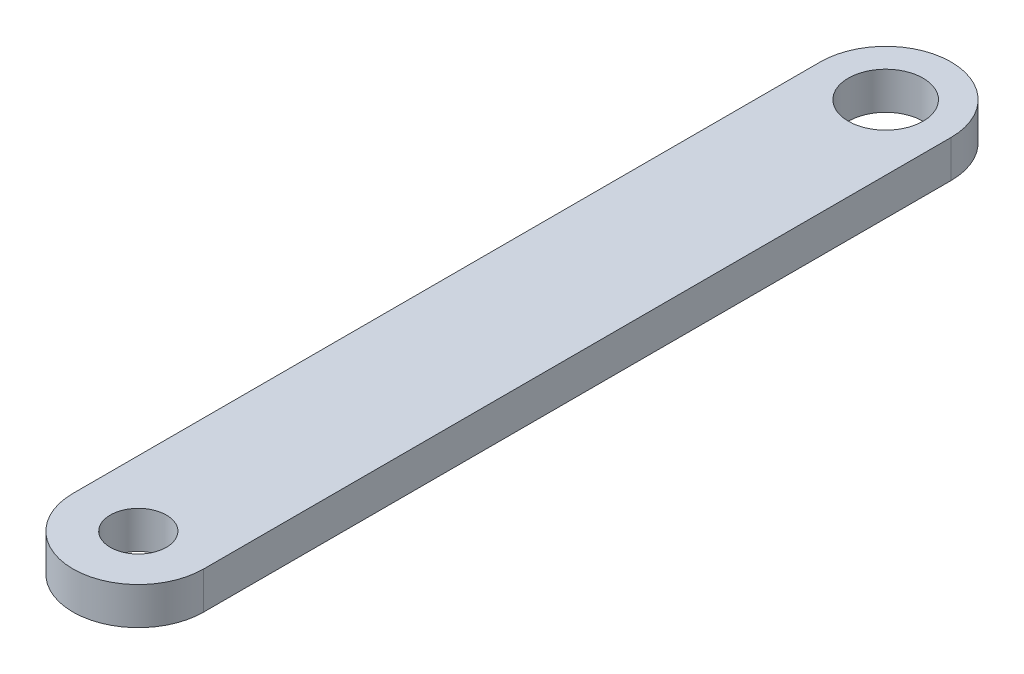
ISO-10303-21;
HEADER;
FILE_DESCRIPTION(('STEP AP214'),'2;1');
FILE_NAME('part.step','',(''),(''),'','','');
FILE_SCHEMA(('AUTOMOTIVE_DESIGN { 1 0 10303 214 1 1 1 1 }'));
ENDSEC;
DATA;
#1=APPLICATION_CONTEXT('core data for automotive mechanical design processes');
#2=APPLICATION_PROTOCOL_DEFINITION('international standard','automotive_design',2000,#1);
#3=PRODUCT_CONTEXT('',#1,'mechanical');
#4=PRODUCT('Part','Part','',(#3));
#5=PRODUCT_RELATED_PRODUCT_CATEGORY('part','',(#4));
#6=PRODUCT_DEFINITION_FORMATION('','',#4);
#7=PRODUCT_DEFINITION_CONTEXT('part definition',#1,'design');
#8=PRODUCT_DEFINITION('design','',#6,#7);
#9=PRODUCT_DEFINITION_SHAPE('','',#8);
#10=(LENGTH_UNIT() NAMED_UNIT(*) SI_UNIT(.MILLI.,.METRE.));
#11=(NAMED_UNIT(*) PLANE_ANGLE_UNIT() SI_UNIT($,.RADIAN.));
#12=(NAMED_UNIT(*) SI_UNIT($,.STERADIAN.) SOLID_ANGLE_UNIT());
#13=UNCERTAINTY_MEASURE_WITH_UNIT(LENGTH_MEASURE(1.E-05),#10,'distance_accuracy_value','');
#14=(GEOMETRIC_REPRESENTATION_CONTEXT(3) GLOBAL_UNCERTAINTY_ASSIGNED_CONTEXT((#13)) GLOBAL_UNIT_ASSIGNED_CONTEXT((#10,
#11,#12)) REPRESENTATION_CONTEXT('',''));
#15=CARTESIAN_POINT('',(0.,0.,0.));
#16=DIRECTION('',(0.,0.,1.));
#17=DIRECTION('',(1.,0.,0.));
#18=AXIS2_PLACEMENT_3D('',#15,#16,#17);
#19=CARTESIAN_POINT('',(0.,2.,-20.));
#20=DIRECTION('',(0.,1.,0.));
#21=DIRECTION('',(0.,0.,1.));
#22=AXIS2_PLACEMENT_3D('',#19,#20,#21);
#23=PLANE('',#22);
#24=CARTESIAN_POINT('',(0.,2.,-20.));
#25=DIRECTION('',(0.,1.,0.));
#26=DIRECTION('',(0.,0.,1.));
#27=AXIS2_PLACEMENT_3D('',#24,#25,#26);
#28=CIRCLE('',#27,2.);
#29=CARTESIAN_POINT('',(0.,2.,-18.));
#30=VERTEX_POINT('',#29);
#31=EDGE_CURVE('E99',#30,#30,#28,.T.);
#32=ORIENTED_EDGE('',*,*,#31,.F.);
#33=EDGE_LOOP('',(#32));
#34=FACE_BOUND('',#33,.T.);
#35=CARTESIAN_POINT('',(0.,2.,-20.));
#36=DIRECTION('',(0.,1.,0.));
#37=DIRECTION('',(0.,0.,1.));
#38=AXIS2_PLACEMENT_3D('',#35,#36,#37);
#39=CIRCLE('',#38,3.49999999999999);
#40=CARTESIAN_POINT('',(3.49999999999999,2.,-20.));
#41=VERTEX_POINT('',#40);
#42=CARTESIAN_POINT('',(-3.49999999999998,2.,-20.));
#43=VERTEX_POINT('',#42);
#44=EDGE_CURVE('E84',#41,#43,#39,.T.);
#45=ORIENTED_EDGE('',*,*,#44,.T.);
#46=DIRECTION('',(0.,0.,1.));
#47=VECTOR('',#46,1.);
#48=CARTESIAN_POINT('',(-3.49999999999998,2.,-20.));
#49=LINE('',#48,#47);
#50=CARTESIAN_POINT('',(-3.49999999999999,2.,20.));
#51=VERTEX_POINT('',#50);
#52=EDGE_CURVE('E79',#43,#51,#49,.T.);
#53=ORIENTED_EDGE('',*,*,#52,.T.);
#54=CARTESIAN_POINT('',(0.,2.,20.));
#55=DIRECTION('',(0.,1.,0.));
#56=DIRECTION('',(0.,0.,1.));
#57=AXIS2_PLACEMENT_3D('',#54,#55,#56);
#58=CIRCLE('',#57,3.49999999999999);
#59=CARTESIAN_POINT('',(3.49999999999999,2.,20.));
#60=VERTEX_POINT('',#59);
#61=EDGE_CURVE('E82',#51,#60,#58,.T.);
#62=ORIENTED_EDGE('',*,*,#61,.T.);
#63=DIRECTION('',(0.,0.,-1.));
#64=VECTOR('',#63,1.);
#65=CARTESIAN_POINT('',(3.49999999999999,2.,-20.));
#66=LINE('',#65,#64);
#67=EDGE_CURVE('E49',#60,#41,#66,.T.);
#68=ORIENTED_EDGE('',*,*,#67,.T.);
#69=EDGE_LOOP('',(#45,#53,#62,#68));
#70=FACE_BOUND('',#69,.T.);
#71=CARTESIAN_POINT('',(0.,2.,20.));
#72=DIRECTION('',(0.,1.,0.));
#73=DIRECTION('',(0.,0.,1.));
#74=AXIS2_PLACEMENT_3D('',#71,#72,#73);
#75=CIRCLE('',#74,1.5);
#76=CARTESIAN_POINT('',(0.,2.,21.5));
#77=VERTEX_POINT('',#76);
#78=EDGE_CURVE('E114',#77,#77,#75,.T.);
#79=ORIENTED_EDGE('',*,*,#78,.F.);
#80=EDGE_LOOP('',(#79));
#81=FACE_BOUND('',#80,.T.);
#82=ADVANCED_FACE('F32',(#34,#70,#81),#23,.T.);
#83=CARTESIAN_POINT('',(0.,0.,-20.));
#84=DIRECTION('',(0.,1.,0.));
#85=DIRECTION('',(0.,0.,1.));
#86=AXIS2_PLACEMENT_3D('',#83,#84,#85);
#87=PLANE('',#86);
#88=CARTESIAN_POINT('',(0.,0.,-20.));
#89=DIRECTION('',(0.,1.,0.));
#90=DIRECTION('',(0.,0.,1.));
#91=AXIS2_PLACEMENT_3D('',#88,#89,#90);
#92=CIRCLE('',#91,3.49999999999999);
#93=CARTESIAN_POINT('',(3.49999999999999,0.,-20.));
#94=VERTEX_POINT('',#93);
#95=CARTESIAN_POINT('',(-3.49999999999998,0.,-20.));
#96=VERTEX_POINT('',#95);
#97=EDGE_CURVE('E96',#94,#96,#92,.T.);
#98=ORIENTED_EDGE('',*,*,#97,.F.);
#99=DIRECTION('',(0.,0.,-1.));
#100=VECTOR('',#99,1.);
#101=CARTESIAN_POINT('',(3.49999999999999,0.,-20.));
#102=LINE('',#101,#100);
#103=CARTESIAN_POINT('',(3.49999999999999,0.,20.));
#104=VERTEX_POINT('',#103);
#105=EDGE_CURVE('E72',#104,#94,#102,.T.);
#106=ORIENTED_EDGE('',*,*,#105,.F.);
#107=CARTESIAN_POINT('',(0.,0.,20.));
#108=DIRECTION('',(0.,1.,0.));
#109=DIRECTION('',(0.,0.,1.));
#110=AXIS2_PLACEMENT_3D('',#107,#108,#109);
#111=CIRCLE('',#110,3.49999999999999);
#112=CARTESIAN_POINT('',(-3.49999999999999,0.,20.));
#113=VERTEX_POINT('',#112);
#114=EDGE_CURVE('E66',#113,#104,#111,.T.);
#115=ORIENTED_EDGE('',*,*,#114,.F.);
#116=DIRECTION('',(0.,0.,1.));
#117=VECTOR('',#116,1.);
#118=CARTESIAN_POINT('',(-3.49999999999998,0.,-20.));
#119=LINE('',#118,#117);
#120=EDGE_CURVE('E88',#96,#113,#119,.T.);
#121=ORIENTED_EDGE('',*,*,#120,.F.);
#122=EDGE_LOOP('',(#98,#106,#115,#121));
#123=FACE_BOUND('',#122,.T.);
#124=CARTESIAN_POINT('',(0.,0.,-20.));
#125=DIRECTION('',(0.,1.,0.));
#126=DIRECTION('',(0.,0.,1.));
#127=AXIS2_PLACEMENT_3D('',#124,#125,#126);
#128=CIRCLE('',#127,2.);
#129=CARTESIAN_POINT('',(0.,0.,-18.));
#130=VERTEX_POINT('',#129);
#131=EDGE_CURVE('E111',#130,#130,#128,.T.);
#132=ORIENTED_EDGE('',*,*,#131,.T.);
#133=EDGE_LOOP('',(#132));
#134=FACE_BOUND('',#133,.T.);
#135=CARTESIAN_POINT('',(0.,0.,20.));
#136=DIRECTION('',(0.,1.,0.));
#137=DIRECTION('',(0.,0.,1.));
#138=AXIS2_PLACEMENT_3D('',#135,#136,#137);
#139=CIRCLE('',#138,1.5);
#140=CARTESIAN_POINT('',(0.,0.,21.5));
#141=VERTEX_POINT('',#140);
#142=EDGE_CURVE('E117',#141,#141,#139,.T.);
#143=ORIENTED_EDGE('',*,*,#142,.T.);
#144=EDGE_LOOP('',(#143));
#145=FACE_BOUND('',#144,.T.);
#146=ADVANCED_FACE('F107',(#123,#134,#145),#87,.F.);
#147=CARTESIAN_POINT('',(0.,2.,-20.));
#148=DIRECTION('',(0.,-1.,0.));
#149=DIRECTION('',(0.,0.,-1.));
#150=AXIS2_PLACEMENT_3D('',#147,#148,#149);
#151=CYLINDRICAL_SURFACE('',#150,3.49999999999999);
#152=ORIENTED_EDGE('',*,*,#97,.T.);
#153=DIRECTION('',(0.,-1.,0.));
#154=VECTOR('',#153,1.);
#155=CARTESIAN_POINT('',(-3.49999999999998,2.,-20.));
#156=LINE('',#155,#154);
#157=EDGE_CURVE('E11',#43,#96,#156,.T.);
#158=ORIENTED_EDGE('',*,*,#157,.F.);
#159=ORIENTED_EDGE('',*,*,#44,.F.);
#160=DIRECTION('',(0.,-1.,0.));
#161=VECTOR('',#160,1.);
#162=CARTESIAN_POINT('',(3.49999999999999,2.,-20.));
#163=LINE('',#162,#161);
#164=EDGE_CURVE('E92',#41,#94,#163,.T.);
#165=ORIENTED_EDGE('',*,*,#164,.T.);
#166=EDGE_LOOP('',(#152,#158,#159,#165));
#167=FACE_BOUND('',#166,.T.);
#168=ADVANCED_FACE('F34',(#167),#151,.T.);
#169=CARTESIAN_POINT('',(-3.49999999999998,2.,-20.));
#170=DIRECTION('',(1.,0.,0.));
#171=DIRECTION('',(0.,0.,-1.));
#172=AXIS2_PLACEMENT_3D('',#169,#170,#171);
#173=PLANE('',#172);
#174=ORIENTED_EDGE('',*,*,#120,.T.);
#175=DIRECTION('',(0.,-1.,0.));
#176=VECTOR('',#175,1.);
#177=CARTESIAN_POINT('',(-3.49999999999999,2.,20.));
#178=LINE('',#177,#176);
#179=EDGE_CURVE('E41',#51,#113,#178,.T.);
#180=ORIENTED_EDGE('',*,*,#179,.F.);
#181=ORIENTED_EDGE('',*,*,#52,.F.);
#182=ORIENTED_EDGE('',*,*,#157,.T.);
#183=EDGE_LOOP('',(#174,#180,#181,#182));
#184=FACE_BOUND('',#183,.T.);
#185=ADVANCED_FACE('F87',(#184),#173,.F.);
#186=CARTESIAN_POINT('',(0.,2.,20.));
#187=DIRECTION('',(0.,-1.,0.));
#188=DIRECTION('',(0.,0.,-1.));
#189=AXIS2_PLACEMENT_3D('',#186,#187,#188);
#190=CYLINDRICAL_SURFACE('',#189,3.49999999999999);
#191=ORIENTED_EDGE('',*,*,#114,.T.);
#192=DIRECTION('',(0.,-1.,0.));
#193=VECTOR('',#192,1.);
#194=CARTESIAN_POINT('',(3.49999999999999,2.,20.));
#195=LINE('',#194,#193);
#196=EDGE_CURVE('E89',#60,#104,#195,.T.);
#197=ORIENTED_EDGE('',*,*,#196,.F.);
#198=ORIENTED_EDGE('',*,*,#61,.F.);
#199=ORIENTED_EDGE('',*,*,#179,.T.);
#200=EDGE_LOOP('',(#191,#197,#198,#199));
#201=FACE_BOUND('',#200,.T.);
#202=ADVANCED_FACE('F90',(#201),#190,.T.);
#203=CARTESIAN_POINT('',(3.49999999999999,2.,-20.));
#204=DIRECTION('',(-1.,0.,0.));
#205=DIRECTION('',(0.,0.,1.));
#206=AXIS2_PLACEMENT_3D('',#203,#204,#205);
#207=PLANE('',#206);
#208=ORIENTED_EDGE('',*,*,#105,.T.);
#209=ORIENTED_EDGE('',*,*,#164,.F.);
#210=ORIENTED_EDGE('',*,*,#67,.F.);
#211=ORIENTED_EDGE('',*,*,#196,.T.);
#212=EDGE_LOOP('',(#208,#209,#210,#211));
#213=FACE_BOUND('',#212,.T.);
#214=ADVANCED_FACE('F104',(#213),#207,.F.);
#215=CARTESIAN_POINT('',(0.,2.,-20.));
#216=DIRECTION('',(0.,-1.,0.));
#217=DIRECTION('',(0.,0.,-1.));
#218=AXIS2_PLACEMENT_3D('',#215,#216,#217);
#219=CYLINDRICAL_SURFACE('',#218,2.);
#220=ORIENTED_EDGE('',*,*,#31,.T.);
#221=EDGE_LOOP('',(#220));
#222=FACE_BOUND('',#221,.T.);
#223=ORIENTED_EDGE('',*,*,#131,.F.);
#224=EDGE_LOOP('',(#223));
#225=FACE_BOUND('',#224,.T.);
#226=ADVANCED_FACE('F134',(#222,#225),#219,.F.);
#227=CARTESIAN_POINT('',(0.,2.,20.));
#228=DIRECTION('',(0.,-1.,0.));
#229=DIRECTION('',(0.,0.,-1.));
#230=AXIS2_PLACEMENT_3D('',#227,#228,#229);
#231=CYLINDRICAL_SURFACE('',#230,1.5);
#232=ORIENTED_EDGE('',*,*,#78,.T.);
#233=EDGE_LOOP('',(#232));
#234=FACE_BOUND('',#233,.T.);
#235=ORIENTED_EDGE('',*,*,#142,.F.);
#236=EDGE_LOOP('',(#235));
#237=FACE_BOUND('',#236,.T.);
#238=ADVANCED_FACE('F123',(#234,#237),#231,.F.);
#239=CLOSED_SHELL('',(#82,#146,#168,#185,#202,#214,#226,#238));
#240=MANIFOLD_SOLID_BREP('B2',#239);
#241=ADVANCED_BREP_SHAPE_REPRESENTATION('',(#18,#240),#14);
#242=SHAPE_DEFINITION_REPRESENTATION(#9,#241);
ENDSEC;
END-ISO-10303-21;
